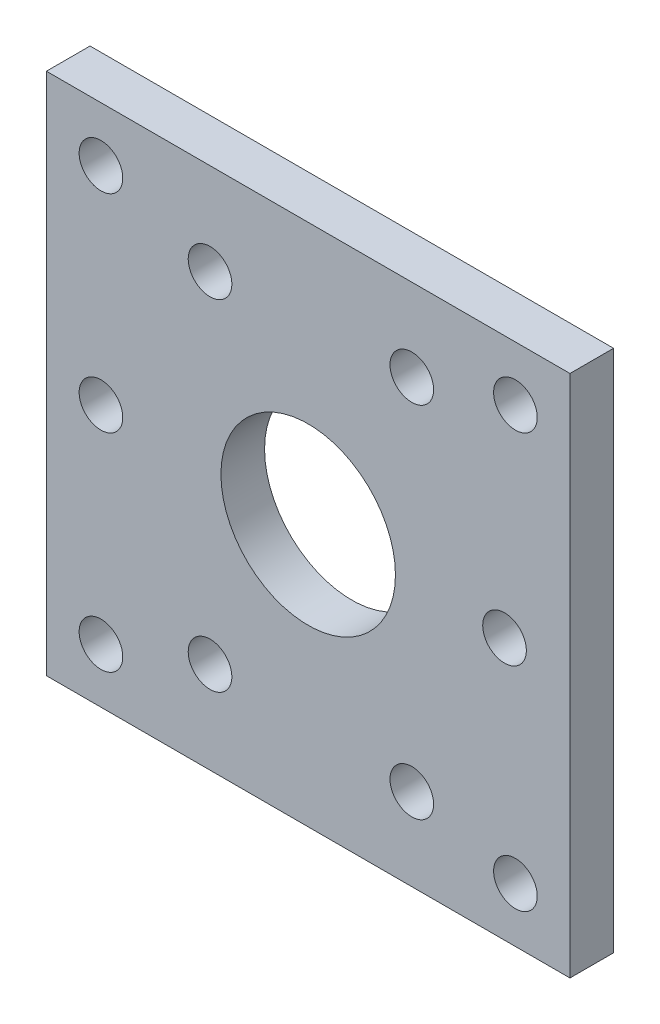
ISO-10303-21;
HEADER;
FILE_DESCRIPTION(('STEP AP214'),'2;1');
FILE_NAME('part.step','',(''),(''),'','','');
FILE_SCHEMA(('AUTOMOTIVE_DESIGN { 1 0 10303 214 1 1 1 1 }'));
ENDSEC;
DATA;
#1=APPLICATION_CONTEXT('core data for automotive mechanical design processes');
#2=APPLICATION_PROTOCOL_DEFINITION('international standard','automotive_design',2000,#1);
#3=PRODUCT_CONTEXT('',#1,'mechanical');
#4=PRODUCT('Part','Part','',(#3));
#5=PRODUCT_RELATED_PRODUCT_CATEGORY('part','',(#4));
#6=PRODUCT_DEFINITION_FORMATION('','',#4);
#7=PRODUCT_DEFINITION_CONTEXT('part definition',#1,'design');
#8=PRODUCT_DEFINITION('design','',#6,#7);
#9=PRODUCT_DEFINITION_SHAPE('','',#8);
#10=(LENGTH_UNIT() NAMED_UNIT(*) SI_UNIT(.MILLI.,.METRE.));
#11=(NAMED_UNIT(*) PLANE_ANGLE_UNIT() SI_UNIT($,.RADIAN.));
#12=(NAMED_UNIT(*) SI_UNIT($,.STERADIAN.) SOLID_ANGLE_UNIT());
#13=UNCERTAINTY_MEASURE_WITH_UNIT(LENGTH_MEASURE(1.E-05),#10,'distance_accuracy_value','');
#14=(GEOMETRIC_REPRESENTATION_CONTEXT(3) GLOBAL_UNCERTAINTY_ASSIGNED_CONTEXT((#13)) GLOBAL_UNIT_ASSIGNED_CONTEXT((#10,
#11,#12)) REPRESENTATION_CONTEXT('',''));
#15=CARTESIAN_POINT('',(0.,0.,0.));
#16=DIRECTION('',(0.,0.,1.));
#17=DIRECTION('',(1.,0.,0.));
#18=AXIS2_PLACEMENT_3D('',#15,#16,#17);
#19=CARTESIAN_POINT('',(0.,0.,5.));
#20=DIRECTION('',(0.,0.,-1.));
#21=DIRECTION('',(-1.,0.,0.));
#22=AXIS2_PLACEMENT_3D('',#19,#20,#21);
#23=PLANE('',#22);
#24=CARTESIAN_POINT('',(23.75,-23.75,5.));
#25=DIRECTION('',(0.,0.,-1.));
#26=DIRECTION('',(-1.,0.,0.));
#27=AXIS2_PLACEMENT_3D('',#24,#25,#26);
#28=CIRCLE('',#27,2.5);
#29=CARTESIAN_POINT('',(21.25,-23.75,5.));
#30=VERTEX_POINT('',#29);
#31=EDGE_CURVE('E154',#30,#30,#28,.F.);
#32=ORIENTED_EDGE('',*,*,#31,.F.);
#33=EDGE_LOOP('',(#32));
#34=FACE_BOUND('',#33,.T.);
#35=CARTESIAN_POINT('',(23.75,23.75,5.));
#36=DIRECTION('',(0.,0.,-1.));
#37=DIRECTION('',(-1.,0.,0.));
#38=AXIS2_PLACEMENT_3D('',#35,#36,#37);
#39=CIRCLE('',#38,2.5);
#40=CARTESIAN_POINT('',(21.25,23.75,5.));
#41=VERTEX_POINT('',#40);
#42=EDGE_CURVE('E162',#41,#41,#39,.F.);
#43=ORIENTED_EDGE('',*,*,#42,.F.);
#44=EDGE_LOOP('',(#43));
#45=FACE_BOUND('',#44,.T.);
#46=CARTESIAN_POINT('',(-23.75,23.75,5.));
#47=DIRECTION('',(0.,0.,-1.));
#48=DIRECTION('',(-1.,0.,0.));
#49=AXIS2_PLACEMENT_3D('',#46,#47,#48);
#50=CIRCLE('',#49,2.5);
#51=CARTESIAN_POINT('',(-26.25,23.75,5.));
#52=VERTEX_POINT('',#51);
#53=EDGE_CURVE('E168',#52,#52,#50,.F.);
#54=ORIENTED_EDGE('',*,*,#53,.F.);
#55=EDGE_LOOP('',(#54));
#56=FACE_BOUND('',#55,.T.);
#57=CARTESIAN_POINT('',(-11.25,19.4855715851499,5.));
#58=DIRECTION('',(0.,0.,-1.));
#59=DIRECTION('',(-1.,0.,0.));
#60=AXIS2_PLACEMENT_3D('',#57,#58,#59);
#61=CIRCLE('',#60,2.5);
#62=CARTESIAN_POINT('',(-13.75,19.4855715851499,5.));
#63=VERTEX_POINT('',#62);
#64=EDGE_CURVE('E137',#63,#63,#61,.F.);
#65=ORIENTED_EDGE('',*,*,#64,.F.);
#66=EDGE_LOOP('',(#65));
#67=FACE_BOUND('',#66,.T.);
#68=CARTESIAN_POINT('',(-23.75,0.,5.));
#69=DIRECTION('',(0.,0.,-1.));
#70=DIRECTION('',(-1.,0.,0.));
#71=AXIS2_PLACEMENT_3D('',#68,#69,#70);
#72=CIRCLE('',#71,2.5);
#73=CARTESIAN_POINT('',(-26.25,0.,5.));
#74=VERTEX_POINT('',#73);
#75=EDGE_CURVE('E130',#74,#74,#72,.F.);
#76=ORIENTED_EDGE('',*,*,#75,.F.);
#77=EDGE_LOOP('',(#76));
#78=FACE_BOUND('',#77,.T.);
#79=CARTESIAN_POINT('',(-11.25,-19.4855715851499,5.));
#80=DIRECTION('',(0.,0.,-1.));
#81=DIRECTION('',(-1.,0.,0.));
#82=AXIS2_PLACEMENT_3D('',#79,#80,#81);
#83=CIRCLE('',#82,2.5);
#84=CARTESIAN_POINT('',(-13.75,-19.4855715851499,5.));
#85=VERTEX_POINT('',#84);
#86=EDGE_CURVE('E138',#85,#85,#83,.F.);
#87=ORIENTED_EDGE('',*,*,#86,.F.);
#88=EDGE_LOOP('',(#87));
#89=FACE_BOUND('',#88,.T.);
#90=CARTESIAN_POINT('',(11.875,-20.5681033398804,5.));
#91=DIRECTION('',(0.,0.,-1.));
#92=DIRECTION('',(-1.,0.,0.));
#93=AXIS2_PLACEMENT_3D('',#90,#91,#92);
#94=CIRCLE('',#93,2.5);
#95=CARTESIAN_POINT('',(9.37500000000003,-20.5681033398804,5.));
#96=VERTEX_POINT('',#95);
#97=EDGE_CURVE('E144',#96,#96,#94,.F.);
#98=ORIENTED_EDGE('',*,*,#97,.F.);
#99=EDGE_LOOP('',(#98));
#100=FACE_BOUND('',#99,.T.);
#101=CARTESIAN_POINT('',(22.5,0.,5.));
#102=DIRECTION('',(0.,0.,-1.));
#103=DIRECTION('',(-1.,0.,0.));
#104=AXIS2_PLACEMENT_3D('',#101,#102,#103);
#105=CIRCLE('',#104,2.5);
#106=CARTESIAN_POINT('',(20.,0.,5.));
#107=VERTEX_POINT('',#106);
#108=EDGE_CURVE('E129',#107,#107,#105,.F.);
#109=ORIENTED_EDGE('',*,*,#108,.F.);
#110=EDGE_LOOP('',(#109));
#111=FACE_BOUND('',#110,.T.);
#112=CARTESIAN_POINT('',(-23.75,-23.75,5.));
#113=DIRECTION('',(0.,0.,-1.));
#114=DIRECTION('',(-1.,0.,0.));
#115=AXIS2_PLACEMENT_3D('',#112,#113,#114);
#116=CIRCLE('',#115,2.5);
#117=CARTESIAN_POINT('',(-26.25,-23.75,5.));
#118=VERTEX_POINT('',#117);
#119=EDGE_CURVE('E161',#118,#118,#116,.F.);
#120=ORIENTED_EDGE('',*,*,#119,.F.);
#121=EDGE_LOOP('',(#120));
#122=FACE_BOUND('',#121,.T.);
#123=CARTESIAN_POINT('',(11.875,20.5681033398804,5.));
#124=DIRECTION('',(0.,0.,-1.));
#125=DIRECTION('',(-1.,0.,0.));
#126=AXIS2_PLACEMENT_3D('',#123,#124,#125);
#127=CIRCLE('',#126,2.5);
#128=CARTESIAN_POINT('',(9.37500000000002,20.5681033398804,5.));
#129=VERTEX_POINT('',#128);
#130=EDGE_CURVE('E121',#129,#129,#127,.F.);
#131=ORIENTED_EDGE('',*,*,#130,.F.);
#132=EDGE_LOOP('',(#131));
#133=FACE_BOUND('',#132,.T.);
#134=DIRECTION('',(0.,1.,0.));
#135=VECTOR('',#134,1.);
#136=CARTESIAN_POINT('',(30.,-30.,5.));
#137=LINE('',#136,#135);
#138=CARTESIAN_POINT('',(30.,-30.,5.));
#139=VERTEX_POINT('',#138);
#140=CARTESIAN_POINT('',(30.,30.,5.));
#141=VERTEX_POINT('',#140);
#142=EDGE_CURVE('E91',#139,#141,#137,.T.);
#143=ORIENTED_EDGE('',*,*,#142,.T.);
#144=DIRECTION('',(-1.,0.,0.));
#145=VECTOR('',#144,1.);
#146=CARTESIAN_POINT('',(-30.,30.,5.));
#147=LINE('',#146,#145);
#148=CARTESIAN_POINT('',(-30.,30.,5.));
#149=VERTEX_POINT('',#148);
#150=EDGE_CURVE('E86',#141,#149,#147,.T.);
#151=ORIENTED_EDGE('',*,*,#150,.T.);
#152=DIRECTION('',(0.,-1.,0.));
#153=VECTOR('',#152,1.);
#154=CARTESIAN_POINT('',(-30.,-30.,5.));
#155=LINE('',#154,#153);
#156=CARTESIAN_POINT('',(-30.,-30.,5.));
#157=VERTEX_POINT('',#156);
#158=EDGE_CURVE('E89',#149,#157,#155,.T.);
#159=ORIENTED_EDGE('',*,*,#158,.T.);
#160=DIRECTION('',(1.,0.,0.));
#161=VECTOR('',#160,1.);
#162=CARTESIAN_POINT('',(-30.,-30.,5.));
#163=LINE('',#162,#161);
#164=EDGE_CURVE('E56',#157,#139,#163,.T.);
#165=ORIENTED_EDGE('',*,*,#164,.T.);
#166=EDGE_LOOP('',(#143,#151,#159,#165));
#167=FACE_BOUND('',#166,.T.);
#168=CARTESIAN_POINT('',(0.,0.,5.));
#169=DIRECTION('',(0.,0.,1.));
#170=DIRECTION('',(1.,0.,0.));
#171=AXIS2_PLACEMENT_3D('',#168,#169,#170);
#172=CIRCLE('',#171,10.);
#173=CARTESIAN_POINT('',(10.,0.,5.));
#174=VERTEX_POINT('',#173);
#175=EDGE_CURVE('E106',#174,#174,#172,.T.);
#176=ORIENTED_EDGE('',*,*,#175,.F.);
#177=EDGE_LOOP('',(#176));
#178=FACE_BOUND('',#177,.T.);
#179=ADVANCED_FACE('F39',(#34,#45,#56,#67,#78,#89,#100,#111,#122,#133,#167,#178),#23,.F.);
#180=CARTESIAN_POINT('',(0.,0.,0.));
#181=DIRECTION('',(0.,0.,-1.));
#182=DIRECTION('',(-1.,0.,0.));
#183=AXIS2_PLACEMENT_3D('',#180,#181,#182);
#184=PLANE('',#183);
#185=CARTESIAN_POINT('',(23.75,-23.75,0.));
#186=DIRECTION('',(0.,0.,-1.));
#187=DIRECTION('',(-1.,0.,0.));
#188=AXIS2_PLACEMENT_3D('',#185,#186,#187);
#189=CIRCLE('',#188,2.5);
#190=CARTESIAN_POINT('',(21.25,-23.75,0.));
#191=VERTEX_POINT('',#190);
#192=EDGE_CURVE('E158',#191,#191,#189,.T.);
#193=ORIENTED_EDGE('',*,*,#192,.F.);
#194=EDGE_LOOP('',(#193));
#195=FACE_BOUND('',#194,.T.);
#196=CARTESIAN_POINT('',(23.75,23.75,0.));
#197=DIRECTION('',(0.,0.,-1.));
#198=DIRECTION('',(-1.,0.,0.));
#199=AXIS2_PLACEMENT_3D('',#196,#197,#198);
#200=CIRCLE('',#199,2.5);
#201=CARTESIAN_POINT('',(21.25,23.75,0.));
#202=VERTEX_POINT('',#201);
#203=EDGE_CURVE('E157',#202,#202,#200,.T.);
#204=ORIENTED_EDGE('',*,*,#203,.F.);
#205=EDGE_LOOP('',(#204));
#206=FACE_BOUND('',#205,.T.);
#207=CARTESIAN_POINT('',(-23.75,23.75,0.));
#208=DIRECTION('',(0.,0.,-1.));
#209=DIRECTION('',(-1.,0.,0.));
#210=AXIS2_PLACEMENT_3D('',#207,#208,#209);
#211=CIRCLE('',#210,2.5);
#212=CARTESIAN_POINT('',(-26.25,23.75,0.));
#213=VERTEX_POINT('',#212);
#214=EDGE_CURVE('E165',#213,#213,#211,.T.);
#215=ORIENTED_EDGE('',*,*,#214,.F.);
#216=EDGE_LOOP('',(#215));
#217=FACE_BOUND('',#216,.T.);
#218=CARTESIAN_POINT('',(-11.25,19.4855715851499,0.));
#219=DIRECTION('',(0.,0.,-1.));
#220=DIRECTION('',(-1.,0.,0.));
#221=AXIS2_PLACEMENT_3D('',#218,#219,#220);
#222=CIRCLE('',#221,2.5);
#223=CARTESIAN_POINT('',(-13.75,19.4855715851499,0.));
#224=VERTEX_POINT('',#223);
#225=EDGE_CURVE('E171',#224,#224,#222,.T.);
#226=ORIENTED_EDGE('',*,*,#225,.F.);
#227=EDGE_LOOP('',(#226));
#228=FACE_BOUND('',#227,.T.);
#229=CARTESIAN_POINT('',(-23.75,0.,0.));
#230=DIRECTION('',(0.,0.,-1.));
#231=DIRECTION('',(-1.,0.,0.));
#232=AXIS2_PLACEMENT_3D('',#229,#230,#231);
#233=CIRCLE('',#232,2.5);
#234=CARTESIAN_POINT('',(-26.25,0.,0.));
#235=VERTEX_POINT('',#234);
#236=EDGE_CURVE('E134',#235,#235,#233,.T.);
#237=ORIENTED_EDGE('',*,*,#236,.F.);
#238=EDGE_LOOP('',(#237));
#239=FACE_BOUND('',#238,.T.);
#240=CARTESIAN_POINT('',(-11.25,-19.4855715851499,0.));
#241=DIRECTION('',(0.,0.,-1.));
#242=DIRECTION('',(-1.,0.,0.));
#243=AXIS2_PLACEMENT_3D('',#240,#241,#242);
#244=CIRCLE('',#243,2.5);
#245=CARTESIAN_POINT('',(-13.75,-19.4855715851499,0.));
#246=VERTEX_POINT('',#245);
#247=EDGE_CURVE('E133',#246,#246,#244,.T.);
#248=ORIENTED_EDGE('',*,*,#247,.F.);
#249=EDGE_LOOP('',(#248));
#250=FACE_BOUND('',#249,.T.);
#251=CARTESIAN_POINT('',(11.875,-20.5681033398804,0.));
#252=DIRECTION('',(0.,0.,-1.));
#253=DIRECTION('',(-1.,0.,0.));
#254=AXIS2_PLACEMENT_3D('',#251,#252,#253);
#255=CIRCLE('',#254,2.5);
#256=CARTESIAN_POINT('',(9.37500000000003,-20.5681033398804,0.));
#257=VERTEX_POINT('',#256);
#258=EDGE_CURVE('E141',#257,#257,#255,.T.);
#259=ORIENTED_EDGE('',*,*,#258,.F.);
#260=EDGE_LOOP('',(#259));
#261=FACE_BOUND('',#260,.T.);
#262=CARTESIAN_POINT('',(22.5,0.,0.));
#263=DIRECTION('',(0.,0.,-1.));
#264=DIRECTION('',(-1.,0.,0.));
#265=AXIS2_PLACEMENT_3D('',#262,#263,#264);
#266=CIRCLE('',#265,2.5);
#267=CARTESIAN_POINT('',(20.,0.,0.));
#268=VERTEX_POINT('',#267);
#269=EDGE_CURVE('E147',#268,#268,#266,.T.);
#270=ORIENTED_EDGE('',*,*,#269,.F.);
#271=EDGE_LOOP('',(#270));
#272=FACE_BOUND('',#271,.T.);
#273=CARTESIAN_POINT('',(-23.75,-23.75,0.));
#274=DIRECTION('',(0.,0.,-1.));
#275=DIRECTION('',(-1.,0.,0.));
#276=AXIS2_PLACEMENT_3D('',#273,#274,#275);
#277=CIRCLE('',#276,2.5);
#278=CARTESIAN_POINT('',(-26.25,-23.75,0.));
#279=VERTEX_POINT('',#278);
#280=EDGE_CURVE('E180',#279,#279,#277,.T.);
#281=ORIENTED_EDGE('',*,*,#280,.F.);
#282=EDGE_LOOP('',(#281));
#283=FACE_BOUND('',#282,.T.);
#284=CARTESIAN_POINT('',(11.875,20.5681033398804,0.));
#285=DIRECTION('',(0.,0.,-1.));
#286=DIRECTION('',(-1.,0.,0.));
#287=AXIS2_PLACEMENT_3D('',#284,#285,#286);
#288=CIRCLE('',#287,2.5);
#289=CARTESIAN_POINT('',(9.37500000000002,20.5681033398804,0.));
#290=VERTEX_POINT('',#289);
#291=EDGE_CURVE('E126',#290,#290,#288,.T.);
#292=ORIENTED_EDGE('',*,*,#291,.F.);
#293=EDGE_LOOP('',(#292));
#294=FACE_BOUND('',#293,.T.);
#295=DIRECTION('',(0.,1.,0.));
#296=VECTOR('',#295,1.);
#297=CARTESIAN_POINT('',(30.,-30.,0.));
#298=LINE('',#297,#296);
#299=CARTESIAN_POINT('',(30.,-30.,0.));
#300=VERTEX_POINT('',#299);
#301=CARTESIAN_POINT('',(30.,30.,0.));
#302=VERTEX_POINT('',#301);
#303=EDGE_CURVE('E103',#300,#302,#298,.T.);
#304=ORIENTED_EDGE('',*,*,#303,.F.);
#305=DIRECTION('',(1.,0.,0.));
#306=VECTOR('',#305,1.);
#307=CARTESIAN_POINT('',(-30.,-30.,0.));
#308=LINE('',#307,#306);
#309=CARTESIAN_POINT('',(-30.,-30.,0.));
#310=VERTEX_POINT('',#309);
#311=EDGE_CURVE('E79',#310,#300,#308,.T.);
#312=ORIENTED_EDGE('',*,*,#311,.F.);
#313=DIRECTION('',(0.,-1.,0.));
#314=VECTOR('',#313,1.);
#315=CARTESIAN_POINT('',(-30.,-30.,0.));
#316=LINE('',#315,#314);
#317=CARTESIAN_POINT('',(-30.,30.,0.));
#318=VERTEX_POINT('',#317);
#319=EDGE_CURVE('E73',#318,#310,#316,.T.);
#320=ORIENTED_EDGE('',*,*,#319,.F.);
#321=DIRECTION('',(-1.,0.,0.));
#322=VECTOR('',#321,1.);
#323=CARTESIAN_POINT('',(-30.,30.,0.));
#324=LINE('',#323,#322);
#325=EDGE_CURVE('E95',#302,#318,#324,.T.);
#326=ORIENTED_EDGE('',*,*,#325,.F.);
#327=EDGE_LOOP('',(#304,#312,#320,#326));
#328=FACE_BOUND('',#327,.T.);
#329=CARTESIAN_POINT('',(0.,0.,0.));
#330=DIRECTION('',(0.,0.,1.));
#331=DIRECTION('',(1.,0.,0.));
#332=AXIS2_PLACEMENT_3D('',#329,#330,#331);
#333=CIRCLE('',#332,10.);
#334=CARTESIAN_POINT('',(10.,0.,0.));
#335=VERTEX_POINT('',#334);
#336=EDGE_CURVE('E118',#335,#335,#333,.T.);
#337=ORIENTED_EDGE('',*,*,#336,.T.);
#338=EDGE_LOOP('',(#337));
#339=FACE_BOUND('',#338,.T.);
#340=ADVANCED_FACE('F114',(#195,#206,#217,#228,#239,#250,#261,#272,#283,#294,#328,#339),#184,.T.);
#341=CARTESIAN_POINT('',(30.,-30.,5.));
#342=DIRECTION('',(-1.,0.,0.));
#343=DIRECTION('',(0.,0.,1.));
#344=AXIS2_PLACEMENT_3D('',#341,#342,#343);
#345=PLANE('',#344);
#346=ORIENTED_EDGE('',*,*,#303,.T.);
#347=DIRECTION('',(0.,0.,-1.));
#348=VECTOR('',#347,1.);
#349=CARTESIAN_POINT('',(30.,30.,5.));
#350=LINE('',#349,#348);
#351=EDGE_CURVE('E11',#141,#302,#350,.T.);
#352=ORIENTED_EDGE('',*,*,#351,.F.);
#353=ORIENTED_EDGE('',*,*,#142,.F.);
#354=DIRECTION('',(0.,0.,-1.));
#355=VECTOR('',#354,1.);
#356=CARTESIAN_POINT('',(30.,-30.,5.));
#357=LINE('',#356,#355);
#358=EDGE_CURVE('E99',#139,#300,#357,.T.);
#359=ORIENTED_EDGE('',*,*,#358,.T.);
#360=EDGE_LOOP('',(#346,#352,#353,#359));
#361=FACE_BOUND('',#360,.T.);
#362=ADVANCED_FACE('F41',(#361),#345,.F.);
#363=CARTESIAN_POINT('',(-30.,30.,5.));
#364=DIRECTION('',(0.,-1.,0.));
#365=DIRECTION('',(0.,0.,-1.));
#366=AXIS2_PLACEMENT_3D('',#363,#364,#365);
#367=PLANE('',#366);
#368=ORIENTED_EDGE('',*,*,#325,.T.);
#369=DIRECTION('',(0.,0.,-1.));
#370=VECTOR('',#369,1.);
#371=CARTESIAN_POINT('',(-30.,30.,5.));
#372=LINE('',#371,#370);
#373=EDGE_CURVE('E48',#149,#318,#372,.T.);
#374=ORIENTED_EDGE('',*,*,#373,.F.);
#375=ORIENTED_EDGE('',*,*,#150,.F.);
#376=ORIENTED_EDGE('',*,*,#351,.T.);
#377=EDGE_LOOP('',(#368,#374,#375,#376));
#378=FACE_BOUND('',#377,.T.);
#379=ADVANCED_FACE('F94',(#378),#367,.F.);
#380=CARTESIAN_POINT('',(-30.,-30.,5.));
#381=DIRECTION('',(1.,0.,0.));
#382=DIRECTION('',(0.,0.,-1.));
#383=AXIS2_PLACEMENT_3D('',#380,#381,#382);
#384=PLANE('',#383);
#385=ORIENTED_EDGE('',*,*,#319,.T.);
#386=DIRECTION('',(0.,0.,-1.));
#387=VECTOR('',#386,1.);
#388=CARTESIAN_POINT('',(-30.,-30.,5.));
#389=LINE('',#388,#387);
#390=EDGE_CURVE('E96',#157,#310,#389,.T.);
#391=ORIENTED_EDGE('',*,*,#390,.F.);
#392=ORIENTED_EDGE('',*,*,#158,.F.);
#393=ORIENTED_EDGE('',*,*,#373,.T.);
#394=EDGE_LOOP('',(#385,#391,#392,#393));
#395=FACE_BOUND('',#394,.T.);
#396=ADVANCED_FACE('F97',(#395),#384,.F.);
#397=CARTESIAN_POINT('',(-30.,-30.,5.));
#398=DIRECTION('',(0.,1.,0.));
#399=DIRECTION('',(0.,0.,1.));
#400=AXIS2_PLACEMENT_3D('',#397,#398,#399);
#401=PLANE('',#400);
#402=ORIENTED_EDGE('',*,*,#311,.T.);
#403=ORIENTED_EDGE('',*,*,#358,.F.);
#404=ORIENTED_EDGE('',*,*,#164,.F.);
#405=ORIENTED_EDGE('',*,*,#390,.T.);
#406=EDGE_LOOP('',(#402,#403,#404,#405));
#407=FACE_BOUND('',#406,.T.);
#408=ADVANCED_FACE('F111',(#407),#401,.F.);
#409=CARTESIAN_POINT('',(0.,0.,5.));
#410=DIRECTION('',(0.,0.,-1.));
#411=DIRECTION('',(-1.,0.,0.));
#412=AXIS2_PLACEMENT_3D('',#409,#410,#411);
#413=CYLINDRICAL_SURFACE('',#412,10.);
#414=ORIENTED_EDGE('',*,*,#175,.T.);
#415=EDGE_LOOP('',(#414));
#416=FACE_BOUND('',#415,.T.);
#417=ORIENTED_EDGE('',*,*,#336,.F.);
#418=EDGE_LOOP('',(#417));
#419=FACE_BOUND('',#418,.T.);
#420=ADVANCED_FACE('F194',(#416,#419),#413,.F.);
#421=CARTESIAN_POINT('',(11.875,20.5681033398804,12.0710678118655));
#422=DIRECTION('',(0.,0.,-1.));
#423=DIRECTION('',(-1.,0.,0.));
#424=AXIS2_PLACEMENT_3D('',#421,#422,#423);
#425=CYLINDRICAL_SURFACE('',#424,2.5);
#426=ORIENTED_EDGE('',*,*,#130,.T.);
#427=EDGE_LOOP('',(#426));
#428=FACE_BOUND('',#427,.T.);
#429=ORIENTED_EDGE('',*,*,#291,.T.);
#430=EDGE_LOOP('',(#429));
#431=FACE_BOUND('',#430,.T.);
#432=ADVANCED_FACE('F192',(#428,#431),#425,.F.);
#433=CARTESIAN_POINT('',(-23.75,-23.75,12.0710678118655));
#434=DIRECTION('',(0.,0.,-1.));
#435=DIRECTION('',(-1.,0.,0.));
#436=AXIS2_PLACEMENT_3D('',#433,#434,#435);
#437=CYLINDRICAL_SURFACE('',#436,2.5);
#438=ORIENTED_EDGE('',*,*,#119,.T.);
#439=EDGE_LOOP('',(#438));
#440=FACE_BOUND('',#439,.T.);
#441=ORIENTED_EDGE('',*,*,#280,.T.);
#442=EDGE_LOOP('',(#441));
#443=FACE_BOUND('',#442,.T.);
#444=ADVANCED_FACE('F184',(#440,#443),#437,.F.);
#445=CARTESIAN_POINT('',(22.5,0.,12.0710678118655));
#446=DIRECTION('',(0.,0.,-1.));
#447=DIRECTION('',(-1.,0.,0.));
#448=AXIS2_PLACEMENT_3D('',#445,#446,#447);
#449=CYLINDRICAL_SURFACE('',#448,2.5);
#450=ORIENTED_EDGE('',*,*,#108,.T.);
#451=EDGE_LOOP('',(#450));
#452=FACE_BOUND('',#451,.T.);
#453=ORIENTED_EDGE('',*,*,#269,.T.);
#454=EDGE_LOOP('',(#453));
#455=FACE_BOUND('',#454,.T.);
#456=ADVANCED_FACE('F201',(#452,#455),#449,.F.);
#457=CARTESIAN_POINT('',(11.875,-20.5681033398804,12.0710678118655));
#458=DIRECTION('',(0.,0.,-1.));
#459=DIRECTION('',(-1.,0.,0.));
#460=AXIS2_PLACEMENT_3D('',#457,#458,#459);
#461=CYLINDRICAL_SURFACE('',#460,2.5);
#462=ORIENTED_EDGE('',*,*,#97,.T.);
#463=EDGE_LOOP('',(#462));
#464=FACE_BOUND('',#463,.T.);
#465=ORIENTED_EDGE('',*,*,#258,.T.);
#466=EDGE_LOOP('',(#465));
#467=FACE_BOUND('',#466,.T.);
#468=ADVANCED_FACE('F251',(#464,#467),#461,.F.);
#469=CARTESIAN_POINT('',(-11.25,-19.4855715851499,12.0710678118655));
#470=DIRECTION('',(0.,0.,-1.));
#471=DIRECTION('',(-1.,0.,0.));
#472=AXIS2_PLACEMENT_3D('',#469,#470,#471);
#473=CYLINDRICAL_SURFACE('',#472,2.5);
#474=ORIENTED_EDGE('',*,*,#86,.T.);
#475=EDGE_LOOP('',(#474));
#476=FACE_BOUND('',#475,.T.);
#477=ORIENTED_EDGE('',*,*,#247,.T.);
#478=EDGE_LOOP('',(#477));
#479=FACE_BOUND('',#478,.T.);
#480=ADVANCED_FACE('F261',(#476,#479),#473,.F.);
#481=CARTESIAN_POINT('',(-23.75,0.,12.0710678118655));
#482=DIRECTION('',(0.,0.,-1.));
#483=DIRECTION('',(-1.,0.,0.));
#484=AXIS2_PLACEMENT_3D('',#481,#482,#483);
#485=CYLINDRICAL_SURFACE('',#484,2.5);
#486=ORIENTED_EDGE('',*,*,#75,.T.);
#487=EDGE_LOOP('',(#486));
#488=FACE_BOUND('',#487,.T.);
#489=ORIENTED_EDGE('',*,*,#236,.T.);
#490=EDGE_LOOP('',(#489));
#491=FACE_BOUND('',#490,.T.);
#492=ADVANCED_FACE('F271',(#488,#491),#485,.F.);
#493=CARTESIAN_POINT('',(-11.25,19.4855715851499,12.0710678118655));
#494=DIRECTION('',(0.,0.,-1.));
#495=DIRECTION('',(-1.,0.,0.));
#496=AXIS2_PLACEMENT_3D('',#493,#494,#495);
#497=CYLINDRICAL_SURFACE('',#496,2.5);
#498=ORIENTED_EDGE('',*,*,#64,.T.);
#499=EDGE_LOOP('',(#498));
#500=FACE_BOUND('',#499,.T.);
#501=ORIENTED_EDGE('',*,*,#225,.T.);
#502=EDGE_LOOP('',(#501));
#503=FACE_BOUND('',#502,.T.);
#504=ADVANCED_FACE('F281',(#500,#503),#497,.F.);
#505=CARTESIAN_POINT('',(-23.75,23.75,12.0710678118655));
#506=DIRECTION('',(0.,0.,-1.));
#507=DIRECTION('',(-1.,0.,0.));
#508=AXIS2_PLACEMENT_3D('',#505,#506,#507);
#509=CYLINDRICAL_SURFACE('',#508,2.5);
#510=ORIENTED_EDGE('',*,*,#53,.T.);
#511=EDGE_LOOP('',(#510));
#512=FACE_BOUND('',#511,.T.);
#513=ORIENTED_EDGE('',*,*,#214,.T.);
#514=EDGE_LOOP('',(#513));
#515=FACE_BOUND('',#514,.T.);
#516=ADVANCED_FACE('F290',(#512,#515),#509,.F.);
#517=CARTESIAN_POINT('',(23.75,23.75,12.0710678118655));
#518=DIRECTION('',(0.,0.,-1.));
#519=DIRECTION('',(-1.,0.,0.));
#520=AXIS2_PLACEMENT_3D('',#517,#518,#519);
#521=CYLINDRICAL_SURFACE('',#520,2.5);
#522=ORIENTED_EDGE('',*,*,#42,.T.);
#523=EDGE_LOOP('',(#522));
#524=FACE_BOUND('',#523,.T.);
#525=ORIENTED_EDGE('',*,*,#203,.T.);
#526=EDGE_LOOP('',(#525));
#527=FACE_BOUND('',#526,.T.);
#528=ADVANCED_FACE('F300',(#524,#527),#521,.F.);
#529=CARTESIAN_POINT('',(23.75,-23.75,12.0710678118655));
#530=DIRECTION('',(0.,0.,-1.));
#531=DIRECTION('',(-1.,0.,0.));
#532=AXIS2_PLACEMENT_3D('',#529,#530,#531);
#533=CYLINDRICAL_SURFACE('',#532,2.5);
#534=ORIENTED_EDGE('',*,*,#31,.T.);
#535=EDGE_LOOP('',(#534));
#536=FACE_BOUND('',#535,.T.);
#537=ORIENTED_EDGE('',*,*,#192,.T.);
#538=EDGE_LOOP('',(#537));
#539=FACE_BOUND('',#538,.T.);
#540=ADVANCED_FACE('F310',(#536,#539),#533,.F.);
#541=CLOSED_SHELL('',(#179,#340,#362,#379,#396,#408,#420,#432,#444,#456,#468,#480,#492,#504,
#516,#528,#540));
#542=MANIFOLD_SOLID_BREP('B2',#541);
#543=ADVANCED_BREP_SHAPE_REPRESENTATION('',(#18,#542),#14);
#544=SHAPE_DEFINITION_REPRESENTATION(#9,#543);
ENDSEC;
END-ISO-10303-21;
